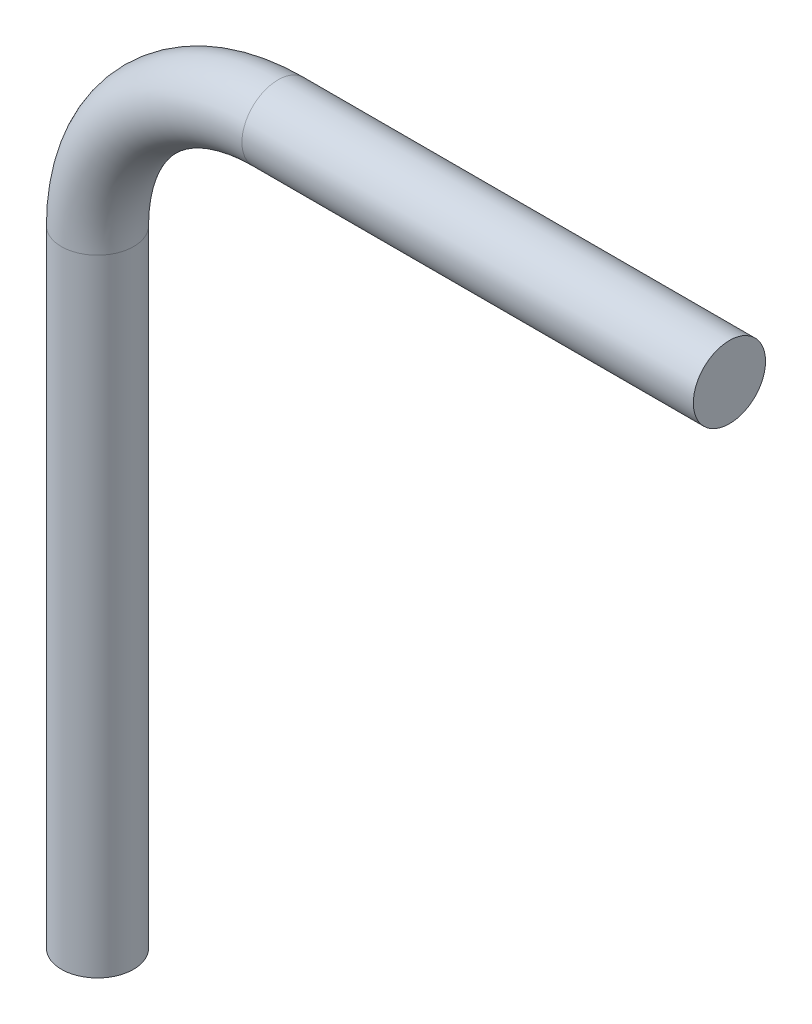
ISO-10303-21;
HEADER;
FILE_DESCRIPTION(('STEP AP214'),'2;1');
FILE_NAME('part.step','',(''),(''),'','','');
FILE_SCHEMA(('AUTOMOTIVE_DESIGN { 1 0 10303 214 1 1 1 1 }'));
ENDSEC;
DATA;
#1=APPLICATION_CONTEXT('core data for automotive mechanical design processes');
#2=APPLICATION_PROTOCOL_DEFINITION('international standard','automotive_design',2000,#1);
#3=PRODUCT_CONTEXT('',#1,'mechanical');
#4=PRODUCT('Part','Part','',(#3));
#5=PRODUCT_RELATED_PRODUCT_CATEGORY('part','',(#4));
#6=PRODUCT_DEFINITION_FORMATION('','',#4);
#7=PRODUCT_DEFINITION_CONTEXT('part definition',#1,'design');
#8=PRODUCT_DEFINITION('design','',#6,#7);
#9=PRODUCT_DEFINITION_SHAPE('','',#8);
#10=(LENGTH_UNIT() NAMED_UNIT(*) SI_UNIT(.MILLI.,.METRE.));
#11=(NAMED_UNIT(*) PLANE_ANGLE_UNIT() SI_UNIT($,.RADIAN.));
#12=(NAMED_UNIT(*) SI_UNIT($,.STERADIAN.) SOLID_ANGLE_UNIT());
#13=UNCERTAINTY_MEASURE_WITH_UNIT(LENGTH_MEASURE(1.E-05),#10,'distance_accuracy_value','');
#14=(GEOMETRIC_REPRESENTATION_CONTEXT(3) GLOBAL_UNCERTAINTY_ASSIGNED_CONTEXT((#13)) GLOBAL_UNIT_ASSIGNED_CONTEXT((#10,
#11,#12)) REPRESENTATION_CONTEXT('',''));
#15=CARTESIAN_POINT('',(0.,0.,0.));
#16=DIRECTION('',(0.,0.,1.));
#17=DIRECTION('',(1.,0.,0.));
#18=AXIS2_PLACEMENT_3D('',#15,#16,#17);
#19=CARTESIAN_POINT('',(2.5,0.,0.));
#20=DIRECTION('',(-1.,0.,0.));
#21=DIRECTION('',(0.,0.,1.));
#22=AXIS2_PLACEMENT_3D('',#19,#20,#21);
#23=CYLINDRICAL_SURFACE('',#22,0.4);
#24=CARTESIAN_POINT('',(2.5,0.,0.));
#25=DIRECTION('',(1.,0.,0.));
#26=DIRECTION('',(0.,0.,-1.));
#27=AXIS2_PLACEMENT_3D('',#24,#25,#26);
#28=CIRCLE('',#27,0.4);
#29=CARTESIAN_POINT('',(2.5,0.,-0.4));
#30=VERTEX_POINT('',#29);
#31=EDGE_CURVE('E11',#30,#30,#28,.T.);
#32=ORIENTED_EDGE('',*,*,#31,.F.);
#33=EDGE_LOOP('',(#32));
#34=FACE_BOUND('',#33,.T.);
#35=CARTESIAN_POINT('',(-2.5,0.,0.));
#36=DIRECTION('',(1.,0.,0.));
#37=DIRECTION('',(0.,0.,-1.));
#38=AXIS2_PLACEMENT_3D('',#35,#36,#37);
#39=CIRCLE('',#38,0.4);
#40=CARTESIAN_POINT('',(-2.5,0.4,0.));
#41=VERTEX_POINT('',#40);
#42=EDGE_CURVE('E46',#41,#41,#39,.T.);
#43=ORIENTED_EDGE('',*,*,#42,.T.);
#44=EDGE_LOOP('',(#43));
#45=FACE_BOUND('',#44,.T.);
#46=ADVANCED_FACE('F43',(#34,#45),#23,.T.);
#47=CARTESIAN_POINT('',(2.5,0.,0.));
#48=DIRECTION('',(1.,0.,0.));
#49=DIRECTION('',(0.,0.,-1.));
#50=AXIS2_PLACEMENT_3D('',#47,#48,#49);
#51=PLANE('',#50);
#52=ORIENTED_EDGE('',*,*,#31,.T.);
#53=EDGE_LOOP('',(#52));
#54=FACE_BOUND('',#53,.T.);
#55=ADVANCED_FACE('F74',(#54),#51,.T.);
#56=CARTESIAN_POINT('',(-4.49999999989268,-8.93343079931929,0.));
#57=DIRECTION('',(0.,1.,0.));
#58=DIRECTION('',(-1.,0.,0.));
#59=AXIS2_PLACEMENT_3D('',#56,#57,#58);
#60=PLANE('',#59);
#61=CARTESIAN_POINT('',(-4.49999999989268,-8.93343079931929,0.));
#62=DIRECTION('',(0.,1.,0.));
#63=DIRECTION('',(-1.,0.,0.));
#64=AXIS2_PLACEMENT_3D('',#61,#62,#63);
#65=CIRCLE('',#64,0.4);
#66=CARTESIAN_POINT('',(-4.89999999989268,-8.93343079931929,0.));
#67=VERTEX_POINT('',#66);
#68=EDGE_CURVE('E55',#67,#67,#65,.T.);
#69=ORIENTED_EDGE('',*,*,#68,.F.);
#70=EDGE_LOOP('',(#69));
#71=FACE_BOUND('',#70,.T.);
#72=ADVANCED_FACE('F66',(#71),#60,.F.);
#73=CARTESIAN_POINT('',(-4.49999999989268,-2.00002071931929,0.));
#74=DIRECTION('',(0.,-1.,0.));
#75=DIRECTION('',(1.,0.,0.));
#76=AXIS2_PLACEMENT_3D('',#73,#74,#75);
#77=CYLINDRICAL_SURFACE('',#76,0.4);
#78=ORIENTED_EDGE('',*,*,#68,.T.);
#79=EDGE_LOOP('',(#78));
#80=FACE_BOUND('',#79,.T.);
#81=CARTESIAN_POINT('',(-4.49999999989268,-2.00002071931929,0.));
#82=DIRECTION('',(-1.03596596455924E-05,0.999999999946339,0.));
#83=DIRECTION('',(-0.999999999946339,-1.03596596455924E-05,0.));
#84=AXIS2_PLACEMENT_3D('',#81,#82,#83);
#85=CIRCLE('',#84,0.4);
#86=CARTESIAN_POINT('',(-4.89999999987121,-2.00002486318315,0.));
#87=VERTEX_POINT('',#86);
#88=EDGE_CURVE('E53',#87,#87,#85,.T.);
#89=ORIENTED_EDGE('',*,*,#88,.F.);
#90=EDGE_LOOP('',(#89));
#91=FACE_BOUND('',#90,.T.);
#92=ADVANCED_FACE('F64',(#80,#91),#77,.T.);
#93=CARTESIAN_POINT('',(-2.5,-2.,0.));
#94=DIRECTION('',(0.,0.,1.));
#95=DIRECTION('',(1.,0.,0.));
#96=AXIS2_PLACEMENT_3D('',#93,#94,#95);
#97=TOROIDAL_SURFACE('',#96,2.,0.4);
#98=CARTESIAN_POINT('',(-2.5,-2.,0.));
#99=DIRECTION('',(0.,0.,1.));
#100=DIRECTION('',(1.,0.,0.));
#101=AXIS2_PLACEMENT_3D('',#98,#99,#100);
#102=CIRCLE('',#101,2.4);
#103=EDGE_CURVE('',#41,#87,#102,.T.);
#104=ORIENTED_EDGE('',*,*,#42,.F.);
#105=ORIENTED_EDGE('',*,*,#88,.T.);
#106=ORIENTED_EDGE('',*,*,#103,.T.);
#107=ORIENTED_EDGE('',*,*,#103,.F.);
#108=EDGE_LOOP('',(#104,#106,#105,#107));
#109=FACE_BOUND('',#108,.T.);
#110=ADVANCED_FACE('F61',(#109),#97,.T.);
#111=CLOSED_SHELL('',(#46,#55,#72,#92,#110));
#112=MANIFOLD_SOLID_BREP('B2',#111);
#113=ADVANCED_BREP_SHAPE_REPRESENTATION('',(#18,#112),#14);
#114=SHAPE_DEFINITION_REPRESENTATION(#9,#113);
ENDSEC;
END-ISO-10303-21;
